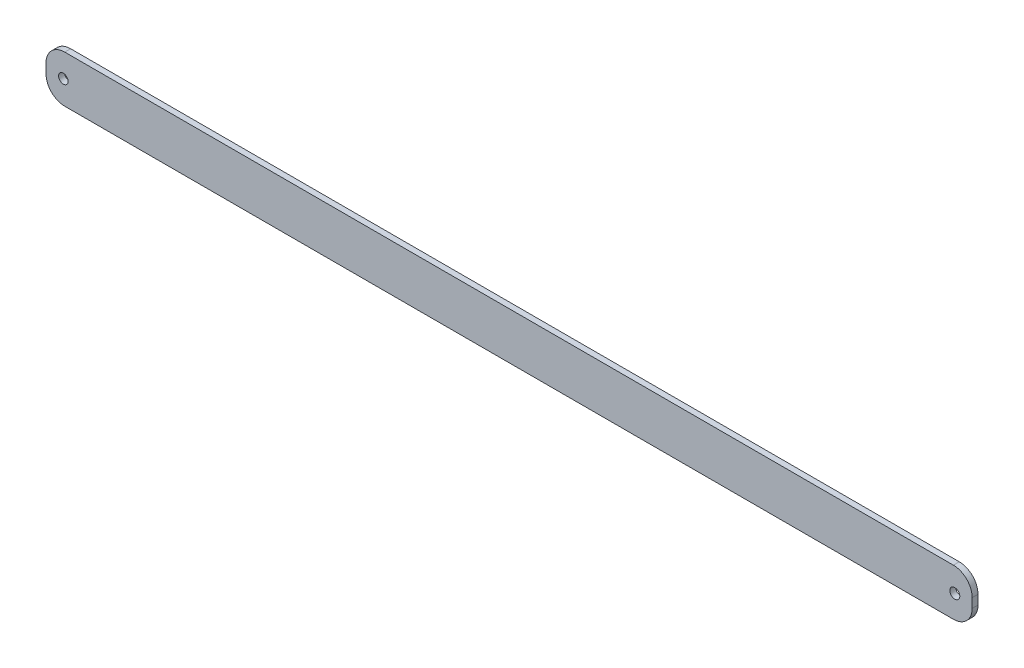
ISO-10303-21;
HEADER;
FILE_DESCRIPTION(('STEP AP214'),'2;1');
FILE_NAME('part.step','',(''),(''),'','','');
FILE_SCHEMA(('AUTOMOTIVE_DESIGN { 1 0 10303 214 1 1 1 1 }'));
ENDSEC;
DATA;
#1=APPLICATION_CONTEXT('core data for automotive mechanical design processes');
#2=APPLICATION_PROTOCOL_DEFINITION('international standard','automotive_design',2000,#1);
#3=PRODUCT_CONTEXT('',#1,'mechanical');
#4=PRODUCT('Part','Part','',(#3));
#5=PRODUCT_RELATED_PRODUCT_CATEGORY('part','',(#4));
#6=PRODUCT_DEFINITION_FORMATION('','',#4);
#7=PRODUCT_DEFINITION_CONTEXT('part definition',#1,'design');
#8=PRODUCT_DEFINITION('design','',#6,#7);
#9=PRODUCT_DEFINITION_SHAPE('','',#8);
#10=(LENGTH_UNIT() NAMED_UNIT(*) SI_UNIT(.MILLI.,.METRE.));
#11=(NAMED_UNIT(*) PLANE_ANGLE_UNIT() SI_UNIT($,.RADIAN.));
#12=(NAMED_UNIT(*) SI_UNIT($,.STERADIAN.) SOLID_ANGLE_UNIT());
#13=UNCERTAINTY_MEASURE_WITH_UNIT(LENGTH_MEASURE(1.E-05),#10,'distance_accuracy_value','');
#14=(GEOMETRIC_REPRESENTATION_CONTEXT(3) GLOBAL_UNCERTAINTY_ASSIGNED_CONTEXT((#13)) GLOBAL_UNIT_ASSIGNED_CONTEXT((#10,
#11,#12)) REPRESENTATION_CONTEXT('',''));
#15=CARTESIAN_POINT('',(0.,0.,0.));
#16=DIRECTION('',(0.,0.,1.));
#17=DIRECTION('',(1.,0.,0.));
#18=AXIS2_PLACEMENT_3D('',#15,#16,#17);
#19=CARTESIAN_POINT('',(-501.65,0.,3.175));
#20=DIRECTION('',(1.,0.,0.));
#21=DIRECTION('',(0.,0.,-1.));
#22=AXIS2_PLACEMENT_3D('',#19,#20,#21);
#23=PLANE('',#22);
#24=DIRECTION('',(0.,-1.,0.));
#25=VECTOR('',#24,1.);
#26=CARTESIAN_POINT('',(-501.65,0.,3.175));
#27=LINE('',#26,#25);
#28=CARTESIAN_POINT('',(-501.65,-10.16,3.175));
#29=VERTEX_POINT('',#28);
#30=CARTESIAN_POINT('',(-501.65,-15.24,3.175));
#31=VERTEX_POINT('',#30);
#32=EDGE_CURVE('E113',#29,#31,#27,.T.);
#33=ORIENTED_EDGE('',*,*,#32,.F.);
#34=DIRECTION('',(0.,0.,-1.));
#35=VECTOR('',#34,1.);
#36=CARTESIAN_POINT('',(-501.65,-10.16,3.175));
#37=LINE('',#36,#35);
#38=CARTESIAN_POINT('',(-501.65,-10.16,0.));
#39=VERTEX_POINT('',#38);
#40=EDGE_CURVE('E147',#29,#39,#37,.T.);
#41=ORIENTED_EDGE('',*,*,#40,.T.);
#42=DIRECTION('',(0.,-1.,0.));
#43=VECTOR('',#42,1.);
#44=CARTESIAN_POINT('',(-501.65,0.,0.));
#45=LINE('',#44,#43);
#46=CARTESIAN_POINT('',(-501.65,-15.24,0.));
#47=VERTEX_POINT('',#46);
#48=EDGE_CURVE('E153',#39,#47,#45,.T.);
#49=ORIENTED_EDGE('',*,*,#48,.T.);
#50=DIRECTION('',(0.,0.,-1.));
#51=VECTOR('',#50,1.);
#52=CARTESIAN_POINT('',(-501.65,-15.24,3.175));
#53=LINE('',#52,#51);
#54=EDGE_CURVE('E142',#47,#31,#53,.F.);
#55=ORIENTED_EDGE('',*,*,#54,.T.);
#56=EDGE_LOOP('',(#33,#41,#49,#55));
#57=FACE_BOUND('',#56,.T.);
#58=ADVANCED_FACE('F33',(#57),#23,.F.);
#59=CARTESIAN_POINT('',(-501.65,-25.4,3.175));
#60=DIRECTION('',(0.,1.,0.));
#61=DIRECTION('',(0.,0.,1.));
#62=AXIS2_PLACEMENT_3D('',#59,#60,#61);
#63=PLANE('',#62);
#64=DIRECTION('',(1.,0.,0.));
#65=VECTOR('',#64,1.);
#66=CARTESIAN_POINT('',(-501.65,-25.4,3.175));
#67=LINE('',#66,#65);
#68=CARTESIAN_POINT('',(-491.49,-25.4,3.175));
#69=VERTEX_POINT('',#68);
#70=CARTESIAN_POINT('',(-10.16,-25.4,3.175));
#71=VERTEX_POINT('',#70);
#72=EDGE_CURVE('E116',#69,#71,#67,.T.);
#73=ORIENTED_EDGE('',*,*,#72,.F.);
#74=DIRECTION('',(0.,0.,-1.));
#75=VECTOR('',#74,1.);
#76=CARTESIAN_POINT('',(-491.49,-25.4,3.175));
#77=LINE('',#76,#75);
#78=CARTESIAN_POINT('',(-491.49,-25.4,0.));
#79=VERTEX_POINT('',#78);
#80=EDGE_CURVE('E136',#69,#79,#77,.T.);
#81=ORIENTED_EDGE('',*,*,#80,.T.);
#82=DIRECTION('',(1.,0.,0.));
#83=VECTOR('',#82,1.);
#84=CARTESIAN_POINT('',(-501.65,-25.4,0.));
#85=LINE('',#84,#83);
#86=CARTESIAN_POINT('',(-10.16,-25.4,0.));
#87=VERTEX_POINT('',#86);
#88=EDGE_CURVE('E118',#79,#87,#85,.T.);
#89=ORIENTED_EDGE('',*,*,#88,.T.);
#90=DIRECTION('',(0.,0.,-1.));
#91=VECTOR('',#90,1.);
#92=CARTESIAN_POINT('',(-10.16,-25.4,3.175));
#93=LINE('',#92,#91);
#94=EDGE_CURVE('E131',#87,#71,#93,.F.);
#95=ORIENTED_EDGE('',*,*,#94,.T.);
#96=EDGE_LOOP('',(#73,#81,#89,#95));
#97=FACE_BOUND('',#96,.T.);
#98=ADVANCED_FACE('F207',(#97),#63,.F.);
#99=CARTESIAN_POINT('',(0.,-25.4,3.175));
#100=DIRECTION('',(-1.,0.,0.));
#101=DIRECTION('',(0.,0.,1.));
#102=AXIS2_PLACEMENT_3D('',#99,#100,#101);
#103=PLANE('',#102);
#104=DIRECTION('',(0.,1.,0.));
#105=VECTOR('',#104,1.);
#106=CARTESIAN_POINT('',(0.,-25.4,3.175));
#107=LINE('',#106,#105);
#108=CARTESIAN_POINT('',(0.,-15.24,3.175));
#109=VERTEX_POINT('',#108);
#110=CARTESIAN_POINT('',(0.,-10.16,3.175));
#111=VERTEX_POINT('',#110);
#112=EDGE_CURVE('E165',#109,#111,#107,.T.);
#113=ORIENTED_EDGE('',*,*,#112,.F.);
#114=DIRECTION('',(0.,0.,-1.));
#115=VECTOR('',#114,1.);
#116=CARTESIAN_POINT('',(0.,-15.24,3.175));
#117=LINE('',#116,#115);
#118=CARTESIAN_POINT('',(0.,-15.24,0.));
#119=VERTEX_POINT('',#118);
#120=EDGE_CURVE('E125',#109,#119,#117,.T.);
#121=ORIENTED_EDGE('',*,*,#120,.T.);
#122=DIRECTION('',(0.,1.,0.));
#123=VECTOR('',#122,1.);
#124=CARTESIAN_POINT('',(0.,-25.4,0.));
#125=LINE('',#124,#123);
#126=CARTESIAN_POINT('',(0.,-10.16,0.));
#127=VERTEX_POINT('',#126);
#128=EDGE_CURVE('E114',#119,#127,#125,.T.);
#129=ORIENTED_EDGE('',*,*,#128,.T.);
#130=DIRECTION('',(0.,0.,-1.));
#131=VECTOR('',#130,1.);
#132=CARTESIAN_POINT('',(0.,-10.16,3.175));
#133=LINE('',#132,#131);
#134=EDGE_CURVE('E105',#127,#111,#133,.F.);
#135=ORIENTED_EDGE('',*,*,#134,.T.);
#136=EDGE_LOOP('',(#113,#121,#129,#135));
#137=FACE_BOUND('',#136,.T.);
#138=ADVANCED_FACE('F212',(#137),#103,.F.);
#139=CARTESIAN_POINT('',(-501.65,0.,3.175));
#140=DIRECTION('',(0.,-1.,0.));
#141=DIRECTION('',(0.,0.,-1.));
#142=AXIS2_PLACEMENT_3D('',#139,#140,#141);
#143=PLANE('',#142);
#144=DIRECTION('',(-1.,0.,0.));
#145=VECTOR('',#144,1.);
#146=CARTESIAN_POINT('',(-501.65,0.,0.));
#147=LINE('',#146,#145);
#148=CARTESIAN_POINT('',(-10.16,0.,0.));
#149=VERTEX_POINT('',#148);
#150=CARTESIAN_POINT('',(-491.49,0.,0.));
#151=VERTEX_POINT('',#150);
#152=EDGE_CURVE('E109',#149,#151,#147,.T.);
#153=ORIENTED_EDGE('',*,*,#152,.T.);
#154=DIRECTION('',(0.,0.,-1.));
#155=VECTOR('',#154,1.);
#156=CARTESIAN_POINT('',(-491.49,0.,3.175));
#157=LINE('',#156,#155);
#158=CARTESIAN_POINT('',(-491.49,0.,3.175));
#159=VERTEX_POINT('',#158);
#160=EDGE_CURVE('E41',#151,#159,#157,.F.);
#161=ORIENTED_EDGE('',*,*,#160,.T.);
#162=DIRECTION('',(-1.,0.,0.));
#163=VECTOR('',#162,1.);
#164=CARTESIAN_POINT('',(-501.65,0.,3.175));
#165=LINE('',#164,#163);
#166=CARTESIAN_POINT('',(-10.16,0.,3.175));
#167=VERTEX_POINT('',#166);
#168=EDGE_CURVE('E110',#167,#159,#165,.T.);
#169=ORIENTED_EDGE('',*,*,#168,.F.);
#170=DIRECTION('',(0.,0.,-1.));
#171=VECTOR('',#170,1.);
#172=CARTESIAN_POINT('',(-10.16,0.,3.175));
#173=LINE('',#172,#171);
#174=EDGE_CURVE('E103',#167,#149,#173,.T.);
#175=ORIENTED_EDGE('',*,*,#174,.T.);
#176=EDGE_LOOP('',(#153,#161,#169,#175));
#177=FACE_BOUND('',#176,.T.);
#178=ADVANCED_FACE('F108',(#177),#143,.F.);
#179=CARTESIAN_POINT('',(0.,0.,3.175));
#180=DIRECTION('',(0.,0.,1.));
#181=DIRECTION('',(1.,0.,0.));
#182=AXIS2_PLACEMENT_3D('',#179,#180,#181);
#183=PLANE('',#182);
#184=CARTESIAN_POINT('',(-9.398,-12.8609091781584,3.175));
#185=DIRECTION('',(0.,0.,-1.));
#186=DIRECTION('',(-1.,0.,0.));
#187=AXIS2_PLACEMENT_3D('',#184,#185,#186);
#188=CIRCLE('',#187,2.71589121796094);
#189=CARTESIAN_POINT('',(-12.1138912179609,-12.8609091781584,3.175));
#190=VERTEX_POINT('',#189);
#191=EDGE_CURVE('E169',#190,#190,#188,.T.);
#192=ORIENTED_EDGE('',*,*,#191,.T.);
#193=EDGE_LOOP('',(#192));
#194=FACE_BOUND('',#193,.T.);
#195=CARTESIAN_POINT('',(-492.252,-12.8433474188796,3.175));
#196=DIRECTION('',(0.,0.,1.));
#197=DIRECTION('',(1.,0.,0.));
#198=AXIS2_PLACEMENT_3D('',#195,#196,#197);
#199=CIRCLE('',#198,2.57582061651368);
#200=CARTESIAN_POINT('',(-489.676179383486,-12.8433474188796,3.175));
#201=VERTEX_POINT('',#200);
#202=EDGE_CURVE('E161',#201,#201,#199,.T.);
#203=ORIENTED_EDGE('',*,*,#202,.F.);
#204=EDGE_LOOP('',(#203));
#205=FACE_BOUND('',#204,.T.);
#206=ORIENTED_EDGE('',*,*,#168,.T.);
#207=CARTESIAN_POINT('',(-491.49,-10.16,3.175));
#208=DIRECTION('',(0.,0.,1.));
#209=DIRECTION('',(1.,0.,0.));
#210=AXIS2_PLACEMENT_3D('',#207,#208,#209);
#211=CIRCLE('',#210,10.16);
#212=EDGE_CURVE('E11',#159,#29,#211,.T.);
#213=ORIENTED_EDGE('',*,*,#212,.T.);
#214=ORIENTED_EDGE('',*,*,#32,.T.);
#215=CARTESIAN_POINT('',(-491.49,-15.24,3.175));
#216=DIRECTION('',(0.,0.,1.));
#217=DIRECTION('',(1.,0.,0.));
#218=AXIS2_PLACEMENT_3D('',#215,#216,#217);
#219=CIRCLE('',#218,10.16);
#220=EDGE_CURVE('E145',#31,#69,#219,.T.);
#221=ORIENTED_EDGE('',*,*,#220,.T.);
#222=ORIENTED_EDGE('',*,*,#72,.T.);
#223=CARTESIAN_POINT('',(-10.16,-15.24,3.175));
#224=DIRECTION('',(0.,0.,1.));
#225=DIRECTION('',(1.,0.,0.));
#226=AXIS2_PLACEMENT_3D('',#223,#224,#225);
#227=CIRCLE('',#226,10.16);
#228=EDGE_CURVE('E134',#71,#109,#227,.T.);
#229=ORIENTED_EDGE('',*,*,#228,.T.);
#230=ORIENTED_EDGE('',*,*,#112,.T.);
#231=CARTESIAN_POINT('',(-10.16,-10.16,3.175));
#232=DIRECTION('',(0.,0.,1.));
#233=DIRECTION('',(1.,0.,0.));
#234=AXIS2_PLACEMENT_3D('',#231,#232,#233);
#235=CIRCLE('',#234,10.16);
#236=EDGE_CURVE('E123',#111,#167,#235,.T.);
#237=ORIENTED_EDGE('',*,*,#236,.T.);
#238=EDGE_LOOP('',(#206,#213,#214,#221,#222,#229,#230,#237));
#239=FACE_BOUND('',#238,.T.);
#240=ADVANCED_FACE('F177',(#194,#205,#239),#183,.T.);
#241=CARTESIAN_POINT('',(0.,0.,0.));
#242=DIRECTION('',(0.,0.,1.));
#243=DIRECTION('',(1.,0.,0.));
#244=AXIS2_PLACEMENT_3D('',#241,#242,#243);
#245=PLANE('',#244);
#246=CARTESIAN_POINT('',(-9.398,-12.8609091781584,0.));
#247=DIRECTION('',(0.,0.,-1.));
#248=DIRECTION('',(-1.,0.,0.));
#249=AXIS2_PLACEMENT_3D('',#246,#247,#248);
#250=CIRCLE('',#249,2.71589121796094);
#251=CARTESIAN_POINT('',(-12.1138912179609,-12.8609091781584,0.));
#252=VERTEX_POINT('',#251);
#253=EDGE_CURVE('E171',#252,#252,#250,.T.);
#254=ORIENTED_EDGE('',*,*,#253,.F.);
#255=EDGE_LOOP('',(#254));
#256=FACE_BOUND('',#255,.T.);
#257=CARTESIAN_POINT('',(-492.252,-12.8433474188796,0.));
#258=DIRECTION('',(0.,0.,1.));
#259=DIRECTION('',(1.,0.,0.));
#260=AXIS2_PLACEMENT_3D('',#257,#258,#259);
#261=CIRCLE('',#260,2.57582061651368);
#262=CARTESIAN_POINT('',(-489.676179383486,-12.8433474188796,0.));
#263=VERTEX_POINT('',#262);
#264=EDGE_CURVE('E158',#263,#263,#261,.T.);
#265=ORIENTED_EDGE('',*,*,#264,.T.);
#266=EDGE_LOOP('',(#265));
#267=FACE_BOUND('',#266,.T.);
#268=ORIENTED_EDGE('',*,*,#48,.F.);
#269=CARTESIAN_POINT('',(-491.49,-10.16,0.));
#270=DIRECTION('',(0.,0.,1.));
#271=DIRECTION('',(1.,0.,0.));
#272=AXIS2_PLACEMENT_3D('',#269,#270,#271);
#273=CIRCLE('',#272,10.16);
#274=EDGE_CURVE('E55',#39,#151,#273,.F.);
#275=ORIENTED_EDGE('',*,*,#274,.T.);
#276=ORIENTED_EDGE('',*,*,#152,.F.);
#277=CARTESIAN_POINT('',(-10.16,-10.16,0.));
#278=DIRECTION('',(0.,0.,1.));
#279=DIRECTION('',(1.,0.,0.));
#280=AXIS2_PLACEMENT_3D('',#277,#278,#279);
#281=CIRCLE('',#280,10.16);
#282=EDGE_CURVE('E99',#149,#127,#281,.F.);
#283=ORIENTED_EDGE('',*,*,#282,.T.);
#284=ORIENTED_EDGE('',*,*,#128,.F.);
#285=CARTESIAN_POINT('',(-10.16,-15.24,0.));
#286=DIRECTION('',(0.,0.,1.));
#287=DIRECTION('',(1.,0.,0.));
#288=AXIS2_PLACEMENT_3D('',#285,#286,#287);
#289=CIRCLE('',#288,10.16);
#290=EDGE_CURVE('E128',#119,#87,#289,.F.);
#291=ORIENTED_EDGE('',*,*,#290,.T.);
#292=ORIENTED_EDGE('',*,*,#88,.F.);
#293=CARTESIAN_POINT('',(-491.49,-15.24,0.));
#294=DIRECTION('',(0.,0.,1.));
#295=DIRECTION('',(1.,0.,0.));
#296=AXIS2_PLACEMENT_3D('',#293,#294,#295);
#297=CIRCLE('',#296,10.16);
#298=EDGE_CURVE('E139',#79,#47,#297,.F.);
#299=ORIENTED_EDGE('',*,*,#298,.T.);
#300=EDGE_LOOP('',(#268,#275,#276,#283,#284,#291,#292,#299));
#301=FACE_BOUND('',#300,.T.);
#302=ADVANCED_FACE('F112',(#256,#267,#301),#245,.F.);
#303=CARTESIAN_POINT('',(-10.16,-10.16,3.175));
#304=DIRECTION('',(0.,0.,-1.));
#305=DIRECTION('',(-1.,0.,0.));
#306=AXIS2_PLACEMENT_3D('',#303,#304,#305);
#307=CYLINDRICAL_SURFACE('',#306,10.16);
#308=ORIENTED_EDGE('',*,*,#236,.F.);
#309=ORIENTED_EDGE('',*,*,#134,.F.);
#310=ORIENTED_EDGE('',*,*,#282,.F.);
#311=ORIENTED_EDGE('',*,*,#174,.F.);
#312=EDGE_LOOP('',(#308,#309,#310,#311));
#313=FACE_BOUND('',#312,.T.);
#314=ADVANCED_FACE('F102',(#313),#307,.T.);
#315=CARTESIAN_POINT('',(-10.16,-15.24,3.175));
#316=DIRECTION('',(0.,0.,-1.));
#317=DIRECTION('',(-1.,0.,0.));
#318=AXIS2_PLACEMENT_3D('',#315,#316,#317);
#319=CYLINDRICAL_SURFACE('',#318,10.16);
#320=ORIENTED_EDGE('',*,*,#228,.F.);
#321=ORIENTED_EDGE('',*,*,#94,.F.);
#322=ORIENTED_EDGE('',*,*,#290,.F.);
#323=ORIENTED_EDGE('',*,*,#120,.F.);
#324=EDGE_LOOP('',(#320,#321,#322,#323));
#325=FACE_BOUND('',#324,.T.);
#326=ADVANCED_FACE('F204',(#325),#319,.T.);
#327=CARTESIAN_POINT('',(-491.49,-15.24,3.175));
#328=DIRECTION('',(0.,0.,-1.));
#329=DIRECTION('',(-1.,0.,0.));
#330=AXIS2_PLACEMENT_3D('',#327,#328,#329);
#331=CYLINDRICAL_SURFACE('',#330,10.16);
#332=ORIENTED_EDGE('',*,*,#220,.F.);
#333=ORIENTED_EDGE('',*,*,#54,.F.);
#334=ORIENTED_EDGE('',*,*,#298,.F.);
#335=ORIENTED_EDGE('',*,*,#80,.F.);
#336=EDGE_LOOP('',(#332,#333,#334,#335));
#337=FACE_BOUND('',#336,.T.);
#338=ADVANCED_FACE('F200',(#337),#331,.T.);
#339=CARTESIAN_POINT('',(-491.49,-10.16,3.175));
#340=DIRECTION('',(0.,0.,-1.));
#341=DIRECTION('',(-1.,0.,0.));
#342=AXIS2_PLACEMENT_3D('',#339,#340,#341);
#343=CYLINDRICAL_SURFACE('',#342,10.16);
#344=ORIENTED_EDGE('',*,*,#212,.F.);
#345=ORIENTED_EDGE('',*,*,#160,.F.);
#346=ORIENTED_EDGE('',*,*,#274,.F.);
#347=ORIENTED_EDGE('',*,*,#40,.F.);
#348=EDGE_LOOP('',(#344,#345,#346,#347));
#349=FACE_BOUND('',#348,.T.);
#350=ADVANCED_FACE('F35',(#349),#343,.T.);
#351=CARTESIAN_POINT('',(-492.252,-12.8433474188796,0.));
#352=DIRECTION('',(0.,0.,1.));
#353=DIRECTION('',(1.,0.,0.));
#354=AXIS2_PLACEMENT_3D('',#351,#352,#353);
#355=CYLINDRICAL_SURFACE('',#354,2.57582061651368);
#356=ORIENTED_EDGE('',*,*,#264,.F.);
#357=EDGE_LOOP('',(#356));
#358=FACE_BOUND('',#357,.T.);
#359=ORIENTED_EDGE('',*,*,#202,.T.);
#360=EDGE_LOOP('',(#359));
#361=FACE_BOUND('',#360,.T.);
#362=ADVANCED_FACE('F183',(#358,#361),#355,.F.);
#363=CARTESIAN_POINT('',(-9.398,-12.8609091781584,3.175));
#364=DIRECTION('',(0.,0.,-1.));
#365=DIRECTION('',(-1.,0.,0.));
#366=AXIS2_PLACEMENT_3D('',#363,#364,#365);
#367=CYLINDRICAL_SURFACE('',#366,2.71589121796094);
#368=ORIENTED_EDGE('',*,*,#191,.F.);
#369=EDGE_LOOP('',(#368));
#370=FACE_BOUND('',#369,.T.);
#371=ORIENTED_EDGE('',*,*,#253,.T.);
#372=EDGE_LOOP('',(#371));
#373=FACE_BOUND('',#372,.T.);
#374=ADVANCED_FACE('F180',(#370,#373),#367,.F.);
#375=CLOSED_SHELL('',(#58,#98,#138,#178,#240,#302,#314,#326,#338,#350,#362,#374));
#376=MANIFOLD_SOLID_BREP('B2',#375);
#377=ADVANCED_BREP_SHAPE_REPRESENTATION('',(#18,#376),#14);
#378=SHAPE_DEFINITION_REPRESENTATION(#9,#377);
ENDSEC;
END-ISO-10303-21;
